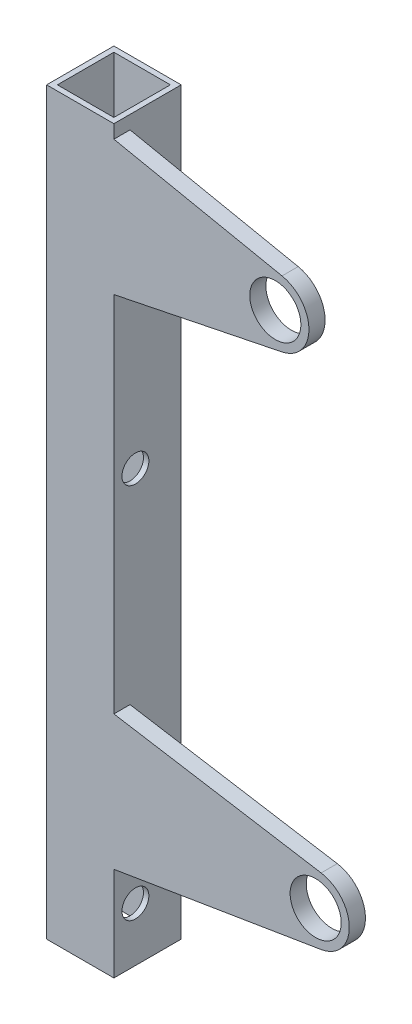
ISO-10303-21;
HEADER;
FILE_DESCRIPTION(('STEP AP214'),'2;1');
FILE_NAME('part.step','',(''),(''),'','','');
FILE_SCHEMA(('AUTOMOTIVE_DESIGN { 1 0 10303 214 1 1 1 1 }'));
ENDSEC;
DATA;
#1=APPLICATION_CONTEXT('core data for automotive mechanical design processes');
#2=APPLICATION_PROTOCOL_DEFINITION('international standard','automotive_design',2000,#1);
#3=PRODUCT_CONTEXT('',#1,'mechanical');
#4=PRODUCT('Part','Part','',(#3));
#5=PRODUCT_RELATED_PRODUCT_CATEGORY('part','',(#4));
#6=PRODUCT_DEFINITION_FORMATION('','',#4);
#7=PRODUCT_DEFINITION_CONTEXT('part definition',#1,'design');
#8=PRODUCT_DEFINITION('design','',#6,#7);
#9=PRODUCT_DEFINITION_SHAPE('','',#8);
#10=(LENGTH_UNIT() NAMED_UNIT(*) SI_UNIT(.MILLI.,.METRE.));
#11=(NAMED_UNIT(*) PLANE_ANGLE_UNIT() SI_UNIT($,.RADIAN.));
#12=(NAMED_UNIT(*) SI_UNIT($,.STERADIAN.) SOLID_ANGLE_UNIT());
#13=UNCERTAINTY_MEASURE_WITH_UNIT(LENGTH_MEASURE(1.E-05),#10,'distance_accuracy_value','');
#14=(GEOMETRIC_REPRESENTATION_CONTEXT(3) GLOBAL_UNCERTAINTY_ASSIGNED_CONTEXT((#13)) GLOBAL_UNIT_ASSIGNED_CONTEXT((#10,
#11,#12)) REPRESENTATION_CONTEXT('',''));
#15=CARTESIAN_POINT('',(0.,0.,0.));
#16=DIRECTION('',(0.,0.,1.));
#17=DIRECTION('',(1.,0.,0.));
#18=AXIS2_PLACEMENT_3D('',#15,#16,#17);
#19=CARTESIAN_POINT('',(12.5,-275.,12.5));
#20=DIRECTION('',(1.,0.,0.));
#21=DIRECTION('',(0.,0.,-1.));
#22=AXIS2_PLACEMENT_3D('',#19,#20,#21);
#23=PLANE('',#22);
#24=CARTESIAN_POINT('',(12.5,-115.,4.5));
#25=DIRECTION('',(1.,0.,0.));
#26=DIRECTION('',(0.,0.,-1.));
#27=AXIS2_PLACEMENT_3D('',#24,#25,#26);
#28=CIRCLE('',#27,5.00000000000001);
#29=CARTESIAN_POINT('',(12.5,-115.,-0.500000000000006));
#30=VERTEX_POINT('',#29);
#31=EDGE_CURVE('E296',#30,#30,#28,.T.);
#32=ORIENTED_EDGE('',*,*,#31,.F.);
#33=EDGE_LOOP('',(#32));
#34=FACE_BOUND('',#33,.T.);
#35=CARTESIAN_POINT('',(12.5,-255.,4.5));
#36=DIRECTION('',(1.,0.,0.));
#37=DIRECTION('',(0.,0.,-1.));
#38=AXIS2_PLACEMENT_3D('',#35,#36,#37);
#39=CIRCLE('',#38,5.00000000000001);
#40=CARTESIAN_POINT('',(12.5,-255.,-0.500000000000006));
#41=VERTEX_POINT('',#40);
#42=EDGE_CURVE('E304',#41,#41,#39,.T.);
#43=ORIENTED_EDGE('',*,*,#42,.F.);
#44=EDGE_LOOP('',(#43));
#45=FACE_BOUND('',#44,.T.);
#46=DIRECTION('',(0.,0.,1.));
#47=VECTOR('',#46,1.);
#48=CARTESIAN_POINT('',(12.5,-240.,6.5));
#49=LINE('',#48,#47);
#50=CARTESIAN_POINT('',(12.5,-240.,6.5));
#51=VERTEX_POINT('',#50);
#52=CARTESIAN_POINT('',(12.5,-240.,12.5));
#53=VERTEX_POINT('',#52);
#54=EDGE_CURVE('E188',#51,#53,#49,.T.);
#55=ORIENTED_EDGE('',*,*,#54,.T.);
#56=DIRECTION('',(0.,1.,0.));
#57=VECTOR('',#56,1.);
#58=CARTESIAN_POINT('',(12.5,-275.,12.5));
#59=LINE('',#58,#57);
#60=CARTESIAN_POINT('',(12.5,-275.,12.5));
#61=VERTEX_POINT('',#60);
#62=EDGE_CURVE('E11',#61,#53,#59,.T.);
#63=ORIENTED_EDGE('',*,*,#62,.F.);
#64=DIRECTION('',(0.,0.,-1.));
#65=VECTOR('',#64,1.);
#66=CARTESIAN_POINT('',(12.5,-275.,12.5));
#67=LINE('',#66,#65);
#68=CARTESIAN_POINT('',(12.5,-275.,-12.5));
#69=VERTEX_POINT('',#68);
#70=EDGE_CURVE('E259',#61,#69,#67,.T.);
#71=ORIENTED_EDGE('',*,*,#70,.T.);
#72=DIRECTION('',(0.,1.,0.));
#73=VECTOR('',#72,1.);
#74=CARTESIAN_POINT('',(12.5,-275.,-12.5));
#75=LINE('',#74,#73);
#76=CARTESIAN_POINT('',(12.5,0.,-12.5));
#77=VERTEX_POINT('',#76);
#78=EDGE_CURVE('E272',#69,#77,#75,.T.);
#79=ORIENTED_EDGE('',*,*,#78,.T.);
#80=DIRECTION('',(0.,0.,-1.));
#81=VECTOR('',#80,1.);
#82=CARTESIAN_POINT('',(12.5,0.,12.5));
#83=LINE('',#82,#81);
#84=CARTESIAN_POINT('',(12.5,0.,12.5));
#85=VERTEX_POINT('',#84);
#86=EDGE_CURVE('E252',#85,#77,#83,.T.);
#87=ORIENTED_EDGE('',*,*,#86,.F.);
#88=CARTESIAN_POINT('',(12.5,-5.,12.5));
#89=VERTEX_POINT('',#88);
#90=EDGE_CURVE('E46',#89,#85,#59,.T.);
#91=ORIENTED_EDGE('',*,*,#90,.F.);
#92=DIRECTION('',(0.,0.,1.));
#93=VECTOR('',#92,1.);
#94=CARTESIAN_POINT('',(12.5,-5.,6.5));
#95=LINE('',#94,#93);
#96=CARTESIAN_POINT('',(12.5,-5.,6.5));
#97=VERTEX_POINT('',#96);
#98=EDGE_CURVE('E224',#97,#89,#95,.T.);
#99=ORIENTED_EDGE('',*,*,#98,.F.);
#100=DIRECTION('',(0.,-1.,0.));
#101=VECTOR('',#100,1.);
#102=CARTESIAN_POINT('',(12.5,-5.,6.5));
#103=LINE('',#102,#101);
#104=CARTESIAN_POINT('',(12.5,-55.,6.5));
#105=VERTEX_POINT('',#104);
#106=EDGE_CURVE('E205',#97,#105,#103,.T.);
#107=ORIENTED_EDGE('',*,*,#106,.T.);
#108=DIRECTION('',(0.,0.,1.));
#109=VECTOR('',#108,1.);
#110=CARTESIAN_POINT('',(12.5,-55.,6.5));
#111=LINE('',#110,#109);
#112=CARTESIAN_POINT('',(12.5,-55.,12.5));
#113=VERTEX_POINT('',#112);
#114=EDGE_CURVE('E221',#105,#113,#111,.T.);
#115=ORIENTED_EDGE('',*,*,#114,.T.);
#116=CARTESIAN_POINT('',(12.5,-190.,12.5));
#117=VERTEX_POINT('',#116);
#118=EDGE_CURVE('E44',#117,#113,#59,.T.);
#119=ORIENTED_EDGE('',*,*,#118,.F.);
#120=DIRECTION('',(0.,0.,1.));
#121=VECTOR('',#120,1.);
#122=CARTESIAN_POINT('',(12.5,-190.,6.5));
#123=LINE('',#122,#121);
#124=CARTESIAN_POINT('',(12.5,-190.,6.5));
#125=VERTEX_POINT('',#124);
#126=EDGE_CURVE('E158',#125,#117,#123,.T.);
#127=ORIENTED_EDGE('',*,*,#126,.F.);
#128=DIRECTION('',(0.,-1.,0.));
#129=VECTOR('',#128,1.);
#130=CARTESIAN_POINT('',(12.5,-240.,6.5));
#131=LINE('',#130,#129);
#132=EDGE_CURVE('E168',#125,#51,#131,.T.);
#133=ORIENTED_EDGE('',*,*,#132,.T.);
#134=EDGE_LOOP('',(#55,#63,#71,#79,#87,#91,#99,#107,#115,#119,#127,#133));
#135=FACE_BOUND('',#134,.T.);
#136=ADVANCED_FACE('F36',(#34,#45,#135),#23,.T.);
#137=CARTESIAN_POINT('',(-12.5,-275.,12.5));
#138=DIRECTION('',(0.,0.,1.));
#139=DIRECTION('',(1.,0.,0.));
#140=AXIS2_PLACEMENT_3D('',#137,#138,#139);
#141=PLANE('',#140);
#142=DIRECTION('',(1.,0.,0.));
#143=VECTOR('',#142,1.);
#144=CARTESIAN_POINT('',(-12.5,0.,12.5));
#145=LINE('',#144,#143);
#146=CARTESIAN_POINT('',(-12.5,0.,12.5));
#147=VERTEX_POINT('',#146);
#148=EDGE_CURVE('E263',#147,#85,#145,.T.);
#149=ORIENTED_EDGE('',*,*,#148,.F.);
#150=DIRECTION('',(0.,1.,0.));
#151=VECTOR('',#150,1.);
#152=CARTESIAN_POINT('',(-12.5,-275.,12.5));
#153=LINE('',#152,#151);
#154=CARTESIAN_POINT('',(-12.5,-275.,12.5));
#155=VERTEX_POINT('',#154);
#156=EDGE_CURVE('E283',#155,#147,#153,.T.);
#157=ORIENTED_EDGE('',*,*,#156,.F.);
#158=DIRECTION('',(1.,0.,0.));
#159=VECTOR('',#158,1.);
#160=CARTESIAN_POINT('',(-12.5,-275.,12.5));
#161=LINE('',#160,#159);
#162=EDGE_CURVE('E269',#155,#61,#161,.T.);
#163=ORIENTED_EDGE('',*,*,#162,.T.);
#164=ORIENTED_EDGE('',*,*,#62,.T.);
#165=DIRECTION('',(0.98674969975976,0.162249899919919,0.));
#166=VECTOR('',#165,1.);
#167=CARTESIAN_POINT('',(89.528123748999,-227.334371246997,12.5));
#168=LINE('',#167,#166);
#169=CARTESIAN_POINT('',(89.528123748999,-227.334371246997,12.5));
#170=VERTEX_POINT('',#169);
#171=EDGE_CURVE('E172',#53,#170,#168,.T.);
#172=ORIENTED_EDGE('',*,*,#171,.T.);
#173=CARTESIAN_POINT('',(87.5,-215.,12.5));
#174=DIRECTION('',(0.,0.,1.));
#175=DIRECTION('',(1.,0.,0.));
#176=AXIS2_PLACEMENT_3D('',#173,#174,#175);
#177=CIRCLE('',#176,12.5);
#178=CARTESIAN_POINT('',(89.528123748999,-202.665628753003,12.5));
#179=VERTEX_POINT('',#178);
#180=EDGE_CURVE('E182',#170,#179,#177,.T.);
#181=ORIENTED_EDGE('',*,*,#180,.T.);
#182=DIRECTION('',(-0.98674969975976,0.162249899919919,0.));
#183=VECTOR('',#182,1.);
#184=CARTESIAN_POINT('',(89.528123748999,-202.665628753003,12.5));
#185=LINE('',#184,#183);
#186=EDGE_CURVE('E53',#179,#117,#185,.T.);
#187=ORIENTED_EDGE('',*,*,#186,.T.);
#188=ORIENTED_EDGE('',*,*,#118,.T.);
#189=DIRECTION('',(0.97981189269868,0.199921621957783,0.));
#190=VECTOR('',#189,1.);
#191=CARTESIAN_POINT('',(74.9990202744723,-42.2476486587335,12.5));
#192=LINE('',#191,#190);
#193=CARTESIAN_POINT('',(74.9990202744723,-42.2476486587335,12.5));
#194=VERTEX_POINT('',#193);
#195=EDGE_CURVE('E202',#113,#194,#192,.T.);
#196=ORIENTED_EDGE('',*,*,#195,.T.);
#197=CARTESIAN_POINT('',(72.5,-30.,12.5));
#198=DIRECTION('',(0.,0.,1.));
#199=DIRECTION('',(1.,0.,0.));
#200=AXIS2_PLACEMENT_3D('',#197,#198,#199);
#201=CIRCLE('',#200,12.5);
#202=CARTESIAN_POINT('',(74.9990202744723,-17.7523513412665,12.5));
#203=VERTEX_POINT('',#202);
#204=EDGE_CURVE('E195',#194,#203,#201,.T.);
#205=ORIENTED_EDGE('',*,*,#204,.T.);
#206=DIRECTION('',(-0.97981189269868,0.199921621957783,0.));
#207=VECTOR('',#206,1.);
#208=CARTESIAN_POINT('',(74.9990202744723,-17.7523513412665,12.5));
#209=LINE('',#208,#207);
#210=EDGE_CURVE('E214',#203,#89,#209,.T.);
#211=ORIENTED_EDGE('',*,*,#210,.T.);
#212=ORIENTED_EDGE('',*,*,#90,.T.);
#213=EDGE_LOOP('',(#149,#157,#163,#164,#172,#181,#187,#188,#196,#205,#211,#212));
#214=FACE_BOUND('',#213,.T.);
#215=CARTESIAN_POINT('',(72.5,-30.,12.5));
#216=DIRECTION('',(0.,0.,1.));
#217=DIRECTION('',(1.,0.,0.));
#218=AXIS2_PLACEMENT_3D('',#215,#216,#217);
#219=CIRCLE('',#218,9.49999999999999);
#220=CARTESIAN_POINT('',(82.,-30.,12.5));
#221=VERTEX_POINT('',#220);
#222=EDGE_CURVE('E187',#221,#221,#219,.T.);
#223=ORIENTED_EDGE('',*,*,#222,.F.);
#224=EDGE_LOOP('',(#223));
#225=FACE_BOUND('',#224,.T.);
#226=CARTESIAN_POINT('',(87.5,-215.,12.5));
#227=DIRECTION('',(0.,0.,1.));
#228=DIRECTION('',(1.,0.,0.));
#229=AXIS2_PLACEMENT_3D('',#226,#227,#228);
#230=CIRCLE('',#229,9.5);
#231=CARTESIAN_POINT('',(97.,-215.,12.5));
#232=VERTEX_POINT('',#231);
#233=EDGE_CURVE('E177',#232,#232,#230,.T.);
#234=ORIENTED_EDGE('',*,*,#233,.F.);
#235=EDGE_LOOP('',(#234));
#236=FACE_BOUND('',#235,.T.);
#237=ADVANCED_FACE('F319',(#214,#225,#236),#141,.T.);
#238=CARTESIAN_POINT('',(-12.5,-275.,12.5));
#239=DIRECTION('',(-1.,0.,0.));
#240=DIRECTION('',(0.,0.,1.));
#241=AXIS2_PLACEMENT_3D('',#238,#239,#240);
#242=PLANE('',#241);
#243=CARTESIAN_POINT('',(-12.5,-115.,4.5));
#244=DIRECTION('',(-1.,0.,0.));
#245=DIRECTION('',(0.,0.,1.));
#246=AXIS2_PLACEMENT_3D('',#243,#244,#245);
#247=CIRCLE('',#246,5.00000000000001);
#248=CARTESIAN_POINT('',(-12.5,-115.,9.50000000000001));
#249=VERTEX_POINT('',#248);
#250=EDGE_CURVE('E290',#249,#249,#247,.F.);
#251=ORIENTED_EDGE('',*,*,#250,.T.);
#252=EDGE_LOOP('',(#251));
#253=FACE_BOUND('',#252,.T.);
#254=CARTESIAN_POINT('',(-12.5,-255.,4.5));
#255=DIRECTION('',(-1.,0.,0.));
#256=DIRECTION('',(0.,0.,1.));
#257=AXIS2_PLACEMENT_3D('',#254,#255,#256);
#258=CIRCLE('',#257,5.00000000000001);
#259=CARTESIAN_POINT('',(-12.5,-255.,9.50000000000001));
#260=VERTEX_POINT('',#259);
#261=EDGE_CURVE('E301',#260,#260,#258,.F.);
#262=ORIENTED_EDGE('',*,*,#261,.T.);
#263=EDGE_LOOP('',(#262));
#264=FACE_BOUND('',#263,.T.);
#265=DIRECTION('',(0.,0.,1.));
#266=VECTOR('',#265,1.);
#267=CARTESIAN_POINT('',(-12.5,0.,12.5));
#268=LINE('',#267,#266);
#269=CARTESIAN_POINT('',(-12.5,0.,-12.5));
#270=VERTEX_POINT('',#269);
#271=EDGE_CURVE('E278',#270,#147,#268,.T.);
#272=ORIENTED_EDGE('',*,*,#271,.F.);
#273=DIRECTION('',(0.,1.,0.));
#274=VECTOR('',#273,1.);
#275=CARTESIAN_POINT('',(-12.5,-275.,-12.5));
#276=LINE('',#275,#274);
#277=CARTESIAN_POINT('',(-12.5,-275.,-12.5));
#278=VERTEX_POINT('',#277);
#279=EDGE_CURVE('E285',#278,#270,#276,.T.);
#280=ORIENTED_EDGE('',*,*,#279,.F.);
#281=DIRECTION('',(0.,0.,1.));
#282=VECTOR('',#281,1.);
#283=CARTESIAN_POINT('',(-12.5,-275.,12.5));
#284=LINE('',#283,#282);
#285=EDGE_CURVE('E266',#278,#155,#284,.T.);
#286=ORIENTED_EDGE('',*,*,#285,.T.);
#287=ORIENTED_EDGE('',*,*,#156,.T.);
#288=EDGE_LOOP('',(#272,#280,#286,#287));
#289=FACE_BOUND('',#288,.T.);
#290=ADVANCED_FACE('F321',(#253,#264,#289),#242,.T.);
#291=CARTESIAN_POINT('',(-12.5,-275.,-12.5));
#292=DIRECTION('',(0.,0.,-1.));
#293=DIRECTION('',(-1.,0.,0.));
#294=AXIS2_PLACEMENT_3D('',#291,#292,#293);
#295=PLANE('',#294);
#296=DIRECTION('',(-1.,0.,0.));
#297=VECTOR('',#296,1.);
#298=CARTESIAN_POINT('',(-12.5,0.,-12.5));
#299=LINE('',#298,#297);
#300=EDGE_CURVE('E275',#77,#270,#299,.T.);
#301=ORIENTED_EDGE('',*,*,#300,.F.);
#302=ORIENTED_EDGE('',*,*,#78,.F.);
#303=DIRECTION('',(-1.,0.,0.));
#304=VECTOR('',#303,1.);
#305=CARTESIAN_POINT('',(-12.5,-275.,-12.5));
#306=LINE('',#305,#304);
#307=EDGE_CURVE('E262',#69,#278,#306,.T.);
#308=ORIENTED_EDGE('',*,*,#307,.T.);
#309=ORIENTED_EDGE('',*,*,#279,.T.);
#310=EDGE_LOOP('',(#301,#302,#308,#309));
#311=FACE_BOUND('',#310,.T.);
#312=ADVANCED_FACE('F327',(#311),#295,.T.);
#313=CARTESIAN_POINT('',(0.,-275.,0.));
#314=DIRECTION('',(0.,-1.,0.));
#315=DIRECTION('',(0.,0.,-1.));
#316=AXIS2_PLACEMENT_3D('',#313,#314,#315);
#317=PLANE('',#316);
#318=DIRECTION('',(0.,0.,1.));
#319=VECTOR('',#318,1.);
#320=CARTESIAN_POINT('',(-10.5,-275.,10.5));
#321=LINE('',#320,#319);
#322=CARTESIAN_POINT('',(-10.5,-275.,-10.5));
#323=VERTEX_POINT('',#322);
#324=CARTESIAN_POINT('',(-10.5,-275.,10.5));
#325=VERTEX_POINT('',#324);
#326=EDGE_CURVE('E227',#323,#325,#321,.T.);
#327=ORIENTED_EDGE('',*,*,#326,.T.);
#328=DIRECTION('',(1.,0.,0.));
#329=VECTOR('',#328,1.);
#330=CARTESIAN_POINT('',(-10.5,-275.,10.5));
#331=LINE('',#330,#329);
#332=CARTESIAN_POINT('',(10.5,-275.,10.5));
#333=VERTEX_POINT('',#332);
#334=EDGE_CURVE('E230',#325,#333,#331,.T.);
#335=ORIENTED_EDGE('',*,*,#334,.T.);
#336=DIRECTION('',(0.,0.,-1.));
#337=VECTOR('',#336,1.);
#338=CARTESIAN_POINT('',(10.5,-275.,10.5));
#339=LINE('',#338,#337);
#340=CARTESIAN_POINT('',(10.5,-275.,-10.5));
#341=VERTEX_POINT('',#340);
#342=EDGE_CURVE('E234',#333,#341,#339,.T.);
#343=ORIENTED_EDGE('',*,*,#342,.T.);
#344=DIRECTION('',(-1.,0.,0.));
#345=VECTOR('',#344,1.);
#346=CARTESIAN_POINT('',(-10.5,-275.,-10.5));
#347=LINE('',#346,#345);
#348=EDGE_CURVE('E237',#341,#323,#347,.T.);
#349=ORIENTED_EDGE('',*,*,#348,.T.);
#350=EDGE_LOOP('',(#327,#335,#343,#349));
#351=FACE_BOUND('',#350,.T.);
#352=ORIENTED_EDGE('',*,*,#70,.F.);
#353=ORIENTED_EDGE('',*,*,#162,.F.);
#354=ORIENTED_EDGE('',*,*,#285,.F.);
#355=ORIENTED_EDGE('',*,*,#307,.F.);
#356=EDGE_LOOP('',(#352,#353,#354,#355));
#357=FACE_BOUND('',#356,.T.);
#358=ADVANCED_FACE('F336',(#351,#357),#317,.T.);
#359=CARTESIAN_POINT('',(0.,0.,0.));
#360=DIRECTION('',(0.,-1.,0.));
#361=DIRECTION('',(0.,0.,-1.));
#362=AXIS2_PLACEMENT_3D('',#359,#360,#361);
#363=PLANE('',#362);
#364=DIRECTION('',(1.,0.,0.));
#365=VECTOR('',#364,1.);
#366=CARTESIAN_POINT('',(-10.5,0.,10.5));
#367=LINE('',#366,#365);
#368=CARTESIAN_POINT('',(-10.5,0.,10.5));
#369=VERTEX_POINT('',#368);
#370=CARTESIAN_POINT('',(10.5,0.,10.5));
#371=VERTEX_POINT('',#370);
#372=EDGE_CURVE('E242',#369,#371,#367,.T.);
#373=ORIENTED_EDGE('',*,*,#372,.F.);
#374=DIRECTION('',(0.,0.,1.));
#375=VECTOR('',#374,1.);
#376=CARTESIAN_POINT('',(-10.5,0.,10.5));
#377=LINE('',#376,#375);
#378=CARTESIAN_POINT('',(-10.5,0.,-10.5));
#379=VERTEX_POINT('',#378);
#380=EDGE_CURVE('E220',#379,#369,#377,.T.);
#381=ORIENTED_EDGE('',*,*,#380,.F.);
#382=DIRECTION('',(-1.,0.,0.));
#383=VECTOR('',#382,1.);
#384=CARTESIAN_POINT('',(-10.5,0.,-10.5));
#385=LINE('',#384,#383);
#386=CARTESIAN_POINT('',(10.5,0.,-10.5));
#387=VERTEX_POINT('',#386);
#388=EDGE_CURVE('E231',#387,#379,#385,.T.);
#389=ORIENTED_EDGE('',*,*,#388,.F.);
#390=DIRECTION('',(0.,0.,-1.));
#391=VECTOR('',#390,1.);
#392=CARTESIAN_POINT('',(10.5,0.,10.5));
#393=LINE('',#392,#391);
#394=EDGE_CURVE('E245',#371,#387,#393,.T.);
#395=ORIENTED_EDGE('',*,*,#394,.F.);
#396=EDGE_LOOP('',(#373,#381,#389,#395));
#397=FACE_BOUND('',#396,.T.);
#398=ORIENTED_EDGE('',*,*,#86,.T.);
#399=ORIENTED_EDGE('',*,*,#300,.T.);
#400=ORIENTED_EDGE('',*,*,#271,.T.);
#401=ORIENTED_EDGE('',*,*,#148,.T.);
#402=EDGE_LOOP('',(#398,#399,#400,#401));
#403=FACE_BOUND('',#402,.T.);
#404=ADVANCED_FACE('F333',(#397,#403),#363,.F.);
#405=CARTESIAN_POINT('',(-10.5,-275.,10.5));
#406=DIRECTION('',(-1.,0.,0.));
#407=DIRECTION('',(0.,0.,1.));
#408=AXIS2_PLACEMENT_3D('',#405,#406,#407);
#409=PLANE('',#408);
#410=CARTESIAN_POINT('',(-10.5,-115.,4.5));
#411=DIRECTION('',(-1.,0.,0.));
#412=DIRECTION('',(0.,0.,1.));
#413=AXIS2_PLACEMENT_3D('',#410,#411,#412);
#414=CIRCLE('',#413,5.00000000000001);
#415=CARTESIAN_POINT('',(-10.5,-115.,9.50000000000001));
#416=VERTEX_POINT('',#415);
#417=EDGE_CURVE('E309',#416,#416,#414,.T.);
#418=ORIENTED_EDGE('',*,*,#417,.T.);
#419=EDGE_LOOP('',(#418));
#420=FACE_BOUND('',#419,.T.);
#421=CARTESIAN_POINT('',(-10.5,-255.,4.5));
#422=DIRECTION('',(-1.,0.,0.));
#423=DIRECTION('',(0.,0.,1.));
#424=AXIS2_PLACEMENT_3D('',#421,#422,#423);
#425=CIRCLE('',#424,5.00000000000001);
#426=CARTESIAN_POINT('',(-10.5,-255.,9.50000000000001));
#427=VERTEX_POINT('',#426);
#428=EDGE_CURVE('E289',#427,#427,#425,.T.);
#429=ORIENTED_EDGE('',*,*,#428,.T.);
#430=EDGE_LOOP('',(#429));
#431=FACE_BOUND('',#430,.T.);
#432=ORIENTED_EDGE('',*,*,#380,.T.);
#433=DIRECTION('',(0.,1.,0.));
#434=VECTOR('',#433,1.);
#435=CARTESIAN_POINT('',(-10.5,-275.,10.5));
#436=LINE('',#435,#434);
#437=EDGE_CURVE('E240',#325,#369,#436,.T.);
#438=ORIENTED_EDGE('',*,*,#437,.F.);
#439=ORIENTED_EDGE('',*,*,#326,.F.);
#440=DIRECTION('',(0.,1.,0.));
#441=VECTOR('',#440,1.);
#442=CARTESIAN_POINT('',(-10.5,-275.,-10.5));
#443=LINE('',#442,#441);
#444=EDGE_CURVE('E250',#323,#379,#443,.T.);
#445=ORIENTED_EDGE('',*,*,#444,.T.);
#446=EDGE_LOOP('',(#432,#438,#439,#445));
#447=FACE_BOUND('',#446,.T.);
#448=ADVANCED_FACE('F384',(#420,#431,#447),#409,.F.);
#449=CARTESIAN_POINT('',(-10.5,-275.,-10.5));
#450=DIRECTION('',(0.,0.,-1.));
#451=DIRECTION('',(-1.,0.,0.));
#452=AXIS2_PLACEMENT_3D('',#449,#450,#451);
#453=PLANE('',#452);
#454=ORIENTED_EDGE('',*,*,#388,.T.);
#455=ORIENTED_EDGE('',*,*,#444,.F.);
#456=ORIENTED_EDGE('',*,*,#348,.F.);
#457=DIRECTION('',(0.,1.,0.));
#458=VECTOR('',#457,1.);
#459=CARTESIAN_POINT('',(10.5,-275.,-10.5));
#460=LINE('',#459,#458);
#461=EDGE_CURVE('E253',#341,#387,#460,.T.);
#462=ORIENTED_EDGE('',*,*,#461,.T.);
#463=EDGE_LOOP('',(#454,#455,#456,#462));
#464=FACE_BOUND('',#463,.T.);
#465=ADVANCED_FACE('F381',(#464),#453,.F.);
#466=CARTESIAN_POINT('',(10.5,-275.,10.5));
#467=DIRECTION('',(1.,0.,0.));
#468=DIRECTION('',(0.,0.,-1.));
#469=AXIS2_PLACEMENT_3D('',#466,#467,#468);
#470=PLANE('',#469);
#471=CARTESIAN_POINT('',(10.5,-115.,4.5));
#472=DIRECTION('',(1.,0.,0.));
#473=DIRECTION('',(0.,0.,-1.));
#474=AXIS2_PLACEMENT_3D('',#471,#472,#473);
#475=CIRCLE('',#474,5.00000000000001);
#476=CARTESIAN_POINT('',(10.5,-115.,-0.500000000000006));
#477=VERTEX_POINT('',#476);
#478=EDGE_CURVE('E39',#477,#477,#475,.T.);
#479=ORIENTED_EDGE('',*,*,#478,.T.);
#480=EDGE_LOOP('',(#479));
#481=FACE_BOUND('',#480,.T.);
#482=CARTESIAN_POINT('',(10.5,-255.,4.5));
#483=DIRECTION('',(1.,0.,0.));
#484=DIRECTION('',(0.,0.,-1.));
#485=AXIS2_PLACEMENT_3D('',#482,#483,#484);
#486=CIRCLE('',#485,5.00000000000001);
#487=CARTESIAN_POINT('',(10.5,-255.,-0.500000000000006));
#488=VERTEX_POINT('',#487);
#489=EDGE_CURVE('E287',#488,#488,#486,.T.);
#490=ORIENTED_EDGE('',*,*,#489,.T.);
#491=EDGE_LOOP('',(#490));
#492=FACE_BOUND('',#491,.T.);
#493=ORIENTED_EDGE('',*,*,#394,.T.);
#494=ORIENTED_EDGE('',*,*,#461,.F.);
#495=ORIENTED_EDGE('',*,*,#342,.F.);
#496=DIRECTION('',(0.,1.,0.));
#497=VECTOR('',#496,1.);
#498=CARTESIAN_POINT('',(10.5,-275.,10.5));
#499=LINE('',#498,#497);
#500=EDGE_CURVE('E255',#333,#371,#499,.T.);
#501=ORIENTED_EDGE('',*,*,#500,.T.);
#502=EDGE_LOOP('',(#493,#494,#495,#501));
#503=FACE_BOUND('',#502,.T.);
#504=ADVANCED_FACE('F376',(#481,#492,#503),#470,.F.);
#505=CARTESIAN_POINT('',(-10.5,-275.,10.5));
#506=DIRECTION('',(0.,0.,1.));
#507=DIRECTION('',(1.,0.,0.));
#508=AXIS2_PLACEMENT_3D('',#505,#506,#507);
#509=PLANE('',#508);
#510=ORIENTED_EDGE('',*,*,#372,.T.);
#511=ORIENTED_EDGE('',*,*,#500,.F.);
#512=ORIENTED_EDGE('',*,*,#334,.F.);
#513=ORIENTED_EDGE('',*,*,#437,.T.);
#514=EDGE_LOOP('',(#510,#511,#512,#513));
#515=FACE_BOUND('',#514,.T.);
#516=ADVANCED_FACE('F369',(#515),#509,.F.);
#517=CARTESIAN_POINT('',(72.5,-30.,6.5));
#518=DIRECTION('',(0.,0.,1.));
#519=DIRECTION('',(1.,0.,0.));
#520=AXIS2_PLACEMENT_3D('',#517,#518,#519);
#521=CYLINDRICAL_SURFACE('',#520,12.5);
#522=ORIENTED_EDGE('',*,*,#204,.F.);
#523=DIRECTION('',(0.,0.,1.));
#524=VECTOR('',#523,1.);
#525=CARTESIAN_POINT('',(74.9990202744723,-42.2476486587335,6.5));
#526=LINE('',#525,#524);
#527=CARTESIAN_POINT('',(74.9990202744723,-42.2476486587335,6.5));
#528=VERTEX_POINT('',#527);
#529=EDGE_CURVE('E218',#528,#194,#526,.T.);
#530=ORIENTED_EDGE('',*,*,#529,.F.);
#531=CARTESIAN_POINT('',(72.5,-30.,6.5));
#532=DIRECTION('',(0.,0.,1.));
#533=DIRECTION('',(1.,0.,0.));
#534=AXIS2_PLACEMENT_3D('',#531,#532,#533);
#535=CIRCLE('',#534,12.5);
#536=CARTESIAN_POINT('',(74.9990202744723,-17.7523513412665,6.5));
#537=VERTEX_POINT('',#536);
#538=EDGE_CURVE('E198',#528,#537,#535,.T.);
#539=ORIENTED_EDGE('',*,*,#538,.T.);
#540=DIRECTION('',(0.,0.,1.));
#541=VECTOR('',#540,1.);
#542=CARTESIAN_POINT('',(74.9990202744723,-17.7523513412665,6.5));
#543=LINE('',#542,#541);
#544=EDGE_CURVE('E211',#537,#203,#543,.T.);
#545=ORIENTED_EDGE('',*,*,#544,.T.);
#546=EDGE_LOOP('',(#522,#530,#539,#545));
#547=FACE_BOUND('',#546,.T.);
#548=ADVANCED_FACE('F367',(#547),#521,.T.);
#549=CARTESIAN_POINT('',(74.9990202744723,-42.2476486587335,6.5));
#550=DIRECTION('',(0.199921621957783,-0.97981189269868,0.));
#551=DIRECTION('',(0.97981189269868,0.199921621957783,0.));
#552=AXIS2_PLACEMENT_3D('',#549,#550,#551);
#553=PLANE('',#552);
#554=ORIENTED_EDGE('',*,*,#195,.F.);
#555=ORIENTED_EDGE('',*,*,#114,.F.);
#556=DIRECTION('',(0.97981189269868,0.199921621957783,0.));
#557=VECTOR('',#556,1.);
#558=CARTESIAN_POINT('',(74.9990202744723,-42.2476486587335,6.5));
#559=LINE('',#558,#557);
#560=EDGE_CURVE('E208',#105,#528,#559,.T.);
#561=ORIENTED_EDGE('',*,*,#560,.T.);
#562=ORIENTED_EDGE('',*,*,#529,.T.);
#563=EDGE_LOOP('',(#554,#555,#561,#562));
#564=FACE_BOUND('',#563,.T.);
#565=ADVANCED_FACE('F365',(#564),#553,.T.);
#566=CARTESIAN_POINT('',(74.9990202744723,-17.7523513412665,6.5));
#567=DIRECTION('',(0.199921621957783,0.97981189269868,0.));
#568=DIRECTION('',(-0.97981189269868,0.199921621957783,0.));
#569=AXIS2_PLACEMENT_3D('',#566,#567,#568);
#570=PLANE('',#569);
#571=ORIENTED_EDGE('',*,*,#210,.F.);
#572=ORIENTED_EDGE('',*,*,#544,.F.);
#573=DIRECTION('',(-0.97981189269868,0.199921621957783,0.));
#574=VECTOR('',#573,1.);
#575=CARTESIAN_POINT('',(74.9990202744723,-17.7523513412665,6.5));
#576=LINE('',#575,#574);
#577=EDGE_CURVE('E201',#537,#97,#576,.T.);
#578=ORIENTED_EDGE('',*,*,#577,.T.);
#579=ORIENTED_EDGE('',*,*,#98,.T.);
#580=EDGE_LOOP('',(#571,#572,#578,#579));
#581=FACE_BOUND('',#580,.T.);
#582=ADVANCED_FACE('F358',(#581),#570,.T.);
#583=CARTESIAN_POINT('',(72.5,-30.,6.5));
#584=DIRECTION('',(0.,0.,1.));
#585=DIRECTION('',(1.,0.,0.));
#586=AXIS2_PLACEMENT_3D('',#583,#584,#585);
#587=PLANE('',#586);
#588=CARTESIAN_POINT('',(72.5,-30.,6.5));
#589=DIRECTION('',(0.,0.,1.));
#590=DIRECTION('',(1.,0.,0.));
#591=AXIS2_PLACEMENT_3D('',#588,#589,#590);
#592=CIRCLE('',#591,9.49999999999999);
#593=CARTESIAN_POINT('',(82.,-30.,6.5));
#594=VERTEX_POINT('',#593);
#595=EDGE_CURVE('E192',#594,#594,#592,.T.);
#596=ORIENTED_EDGE('',*,*,#595,.T.);
#597=EDGE_LOOP('',(#596));
#598=FACE_BOUND('',#597,.T.);
#599=ORIENTED_EDGE('',*,*,#538,.F.);
#600=ORIENTED_EDGE('',*,*,#560,.F.);
#601=ORIENTED_EDGE('',*,*,#106,.F.);
#602=ORIENTED_EDGE('',*,*,#577,.F.);
#603=EDGE_LOOP('',(#599,#600,#601,#602));
#604=FACE_BOUND('',#603,.T.);
#605=ADVANCED_FACE('F363',(#598,#604),#587,.F.);
#606=CARTESIAN_POINT('',(72.5,-30.,6.5));
#607=DIRECTION('',(0.,0.,1.));
#608=DIRECTION('',(1.,0.,0.));
#609=AXIS2_PLACEMENT_3D('',#606,#607,#608);
#610=CYLINDRICAL_SURFACE('',#609,9.49999999999999);
#611=ORIENTED_EDGE('',*,*,#595,.F.);
#612=EDGE_LOOP('',(#611));
#613=FACE_BOUND('',#612,.T.);
#614=ORIENTED_EDGE('',*,*,#222,.T.);
#615=EDGE_LOOP('',(#614));
#616=FACE_BOUND('',#615,.T.);
#617=ADVANCED_FACE('F447',(#613,#616),#610,.F.);
#618=CARTESIAN_POINT('',(87.5,-215.,6.5));
#619=DIRECTION('',(0.,0.,1.));
#620=DIRECTION('',(1.,0.,0.));
#621=AXIS2_PLACEMENT_3D('',#618,#619,#620);
#622=CYLINDRICAL_SURFACE('',#621,12.5);
#623=ORIENTED_EDGE('',*,*,#180,.F.);
#624=DIRECTION('',(0.,0.,1.));
#625=VECTOR('',#624,1.);
#626=CARTESIAN_POINT('',(89.528123748999,-227.334371246997,6.5));
#627=LINE('',#626,#625);
#628=CARTESIAN_POINT('',(89.528123748999,-227.334371246997,6.5));
#629=VERTEX_POINT('',#628);
#630=EDGE_CURVE('E171',#629,#170,#627,.T.);
#631=ORIENTED_EDGE('',*,*,#630,.F.);
#632=CARTESIAN_POINT('',(87.5,-215.,6.5));
#633=DIRECTION('',(0.,0.,1.));
#634=DIRECTION('',(1.,0.,0.));
#635=AXIS2_PLACEMENT_3D('',#632,#633,#634);
#636=CIRCLE('',#635,12.5);
#637=CARTESIAN_POINT('',(89.528123748999,-202.665628753003,6.5));
#638=VERTEX_POINT('',#637);
#639=EDGE_CURVE('E165',#629,#638,#636,.T.);
#640=ORIENTED_EDGE('',*,*,#639,.T.);
#641=DIRECTION('',(0.,0.,1.));
#642=VECTOR('',#641,1.);
#643=CARTESIAN_POINT('',(89.528123748999,-202.665628753003,6.5));
#644=LINE('',#643,#642);
#645=EDGE_CURVE('E150',#638,#179,#644,.T.);
#646=ORIENTED_EDGE('',*,*,#645,.T.);
#647=EDGE_LOOP('',(#623,#631,#640,#646));
#648=FACE_BOUND('',#647,.T.);
#649=ADVANCED_FACE('F170',(#648),#622,.T.);
#650=CARTESIAN_POINT('',(89.528123748999,-227.334371246997,6.5));
#651=DIRECTION('',(0.162249899919919,-0.98674969975976,0.));
#652=DIRECTION('',(0.98674969975976,0.162249899919919,0.));
#653=AXIS2_PLACEMENT_3D('',#650,#651,#652);
#654=PLANE('',#653);
#655=ORIENTED_EDGE('',*,*,#171,.F.);
#656=ORIENTED_EDGE('',*,*,#54,.F.);
#657=DIRECTION('',(0.98674969975976,0.162249899919919,0.));
#658=VECTOR('',#657,1.);
#659=CARTESIAN_POINT('',(89.528123748999,-227.334371246997,6.5));
#660=LINE('',#659,#658);
#661=EDGE_CURVE('E159',#51,#629,#660,.T.);
#662=ORIENTED_EDGE('',*,*,#661,.T.);
#663=ORIENTED_EDGE('',*,*,#630,.T.);
#664=EDGE_LOOP('',(#655,#656,#662,#663));
#665=FACE_BOUND('',#664,.T.);
#666=ADVANCED_FACE('F439',(#665),#654,.T.);
#667=CARTESIAN_POINT('',(89.528123748999,-202.665628753003,6.5));
#668=DIRECTION('',(0.162249899919919,0.98674969975976,0.));
#669=DIRECTION('',(-0.98674969975976,0.162249899919919,0.));
#670=AXIS2_PLACEMENT_3D('',#667,#668,#669);
#671=PLANE('',#670);
#672=ORIENTED_EDGE('',*,*,#186,.F.);
#673=ORIENTED_EDGE('',*,*,#645,.F.);
#674=DIRECTION('',(-0.98674969975976,0.162249899919919,0.));
#675=VECTOR('',#674,1.);
#676=CARTESIAN_POINT('',(89.528123748999,-202.665628753003,6.5));
#677=LINE('',#676,#675);
#678=EDGE_CURVE('E153',#638,#125,#677,.T.);
#679=ORIENTED_EDGE('',*,*,#678,.T.);
#680=ORIENTED_EDGE('',*,*,#126,.T.);
#681=EDGE_LOOP('',(#672,#673,#679,#680));
#682=FACE_BOUND('',#681,.T.);
#683=ADVANCED_FACE('F152',(#682),#671,.T.);
#684=CARTESIAN_POINT('',(87.5,-215.,6.5));
#685=DIRECTION('',(0.,0.,1.));
#686=DIRECTION('',(1.,0.,0.));
#687=AXIS2_PLACEMENT_3D('',#684,#685,#686);
#688=PLANE('',#687);
#689=CARTESIAN_POINT('',(87.5,-215.,6.5));
#690=DIRECTION('',(0.,0.,1.));
#691=DIRECTION('',(1.,0.,0.));
#692=AXIS2_PLACEMENT_3D('',#689,#690,#691);
#693=CIRCLE('',#692,9.5);
#694=CARTESIAN_POINT('',(97.,-215.,6.5));
#695=VERTEX_POINT('',#694);
#696=EDGE_CURVE('E184',#695,#695,#693,.T.);
#697=ORIENTED_EDGE('',*,*,#696,.T.);
#698=EDGE_LOOP('',(#697));
#699=FACE_BOUND('',#698,.T.);
#700=ORIENTED_EDGE('',*,*,#639,.F.);
#701=ORIENTED_EDGE('',*,*,#661,.F.);
#702=ORIENTED_EDGE('',*,*,#132,.F.);
#703=ORIENTED_EDGE('',*,*,#678,.F.);
#704=EDGE_LOOP('',(#700,#701,#702,#703));
#705=FACE_BOUND('',#704,.T.);
#706=ADVANCED_FACE('F163',(#699,#705),#688,.F.);
#707=CARTESIAN_POINT('',(87.5,-215.,6.5));
#708=DIRECTION('',(0.,0.,1.));
#709=DIRECTION('',(1.,0.,0.));
#710=AXIS2_PLACEMENT_3D('',#707,#708,#709);
#711=CYLINDRICAL_SURFACE('',#710,9.5);
#712=ORIENTED_EDGE('',*,*,#696,.F.);
#713=EDGE_LOOP('',(#712));
#714=FACE_BOUND('',#713,.T.);
#715=ORIENTED_EDGE('',*,*,#233,.T.);
#716=EDGE_LOOP('',(#715));
#717=FACE_BOUND('',#716,.T.);
#718=ADVANCED_FACE('F317',(#714,#717),#711,.F.);
#719=CARTESIAN_POINT('',(-26.642135623731,-255.,4.5));
#720=DIRECTION('',(1.,0.,0.));
#721=DIRECTION('',(0.,0.,-1.));
#722=AXIS2_PLACEMENT_3D('',#719,#720,#721);
#723=CYLINDRICAL_SURFACE('',#722,5.00000000000001);
#724=ORIENTED_EDGE('',*,*,#42,.T.);
#725=EDGE_LOOP('',(#724));
#726=FACE_BOUND('',#725,.T.);
#727=ORIENTED_EDGE('',*,*,#489,.F.);
#728=EDGE_LOOP('',(#727));
#729=FACE_BOUND('',#728,.T.);
#730=ADVANCED_FACE('F415',(#726,#729),#723,.F.);
#731=CARTESIAN_POINT('',(-26.642135623731,-115.,4.5));
#732=DIRECTION('',(1.,0.,0.));
#733=DIRECTION('',(0.,0.,-1.));
#734=AXIS2_PLACEMENT_3D('',#731,#732,#733);
#735=CYLINDRICAL_SURFACE('',#734,5.00000000000001);
#736=ORIENTED_EDGE('',*,*,#31,.T.);
#737=EDGE_LOOP('',(#736));
#738=FACE_BOUND('',#737,.T.);
#739=ORIENTED_EDGE('',*,*,#478,.F.);
#740=EDGE_LOOP('',(#739));
#741=FACE_BOUND('',#740,.T.);
#742=ADVANCED_FACE('F412',(#738,#741),#735,.F.);
#743=ORIENTED_EDGE('',*,*,#261,.F.);
#744=EDGE_LOOP('',(#743));
#745=FACE_BOUND('',#744,.T.);
#746=ORIENTED_EDGE('',*,*,#428,.F.);
#747=EDGE_LOOP('',(#746));
#748=FACE_BOUND('',#747,.T.);
#749=ADVANCED_FACE('F409',(#745,#748),#723,.F.);
#750=ORIENTED_EDGE('',*,*,#250,.F.);
#751=EDGE_LOOP('',(#750));
#752=FACE_BOUND('',#751,.T.);
#753=ORIENTED_EDGE('',*,*,#417,.F.);
#754=EDGE_LOOP('',(#753));
#755=FACE_BOUND('',#754,.T.);
#756=ADVANCED_FACE('F411',(#752,#755),#735,.F.);
#757=CLOSED_SHELL('',(#136,#237,#290,#312,#358,#404,#448,#465,#504,#516,#548,#565,#582,#605,
#617,#649,#666,#683,#706,#718,#730,#742,#749,#756));
#758=MANIFOLD_SOLID_BREP('B2',#757);
#759=ADVANCED_BREP_SHAPE_REPRESENTATION('',(#18,#758),#14);
#760=SHAPE_DEFINITION_REPRESENTATION(#9,#759);
ENDSEC;
END-ISO-10303-21;
